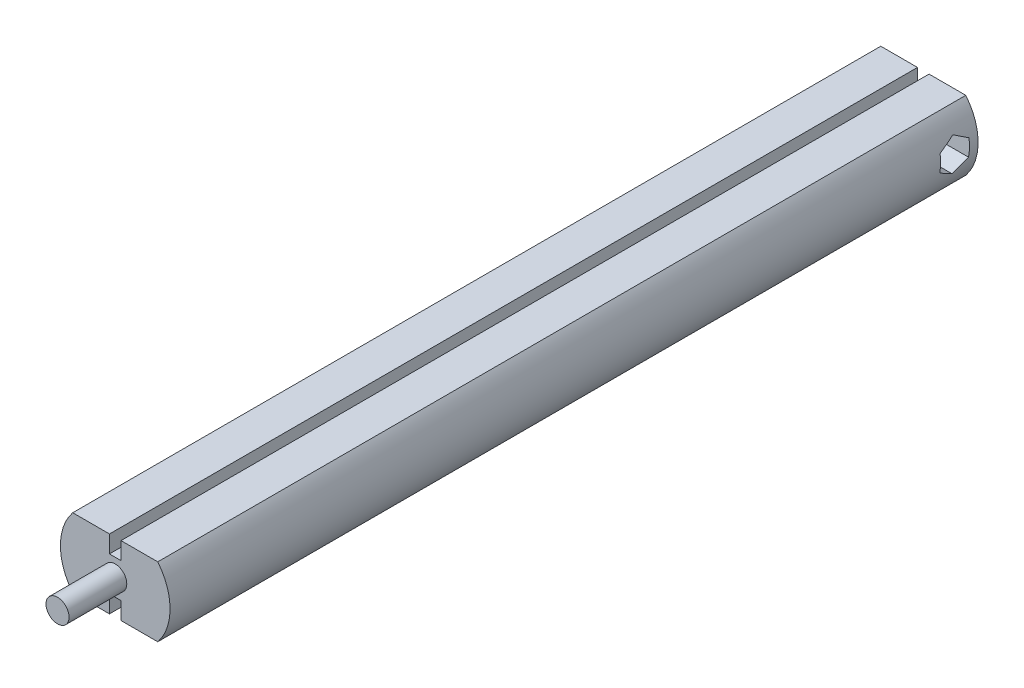
ISO-10303-21;
HEADER;
FILE_DESCRIPTION(('STEP AP214'),'2;1');
FILE_NAME('part.step','',(''),(''),'','','');
FILE_SCHEMA(('AUTOMOTIVE_DESIGN { 1 0 10303 214 1 1 1 1 }'));
ENDSEC;
DATA;
#1=APPLICATION_CONTEXT('core data for automotive mechanical design processes');
#2=APPLICATION_PROTOCOL_DEFINITION('international standard','automotive_design',2000,#1);
#3=PRODUCT_CONTEXT('',#1,'mechanical');
#4=PRODUCT('Part','Part','',(#3));
#5=PRODUCT_RELATED_PRODUCT_CATEGORY('part','',(#4));
#6=PRODUCT_DEFINITION_FORMATION('','',#4);
#7=PRODUCT_DEFINITION_CONTEXT('part definition',#1,'design');
#8=PRODUCT_DEFINITION('design','',#6,#7);
#9=PRODUCT_DEFINITION_SHAPE('','',#8);
#10=(LENGTH_UNIT() NAMED_UNIT(*) SI_UNIT(.MILLI.,.METRE.));
#11=(NAMED_UNIT(*) PLANE_ANGLE_UNIT() SI_UNIT($,.RADIAN.));
#12=(NAMED_UNIT(*) SI_UNIT($,.STERADIAN.) SOLID_ANGLE_UNIT());
#13=UNCERTAINTY_MEASURE_WITH_UNIT(LENGTH_MEASURE(1.E-05),#10,'distance_accuracy_value','');
#14=(GEOMETRIC_REPRESENTATION_CONTEXT(3) GLOBAL_UNCERTAINTY_ASSIGNED_CONTEXT((#13)) GLOBAL_UNIT_ASSIGNED_CONTEXT((#10,
#11,#12)) REPRESENTATION_CONTEXT('',''));
#15=CARTESIAN_POINT('',(0.,0.,0.));
#16=DIRECTION('',(0.,0.,1.));
#17=DIRECTION('',(1.,0.,0.));
#18=AXIS2_PLACEMENT_3D('',#15,#16,#17);
#19=CARTESIAN_POINT('',(0.,0.,70.));
#20=DIRECTION('',(0.,0.,1.));
#21=DIRECTION('',(1.,0.,0.));
#22=AXIS2_PLACEMENT_3D('',#19,#20,#21);
#23=PLANE('',#22);
#24=CARTESIAN_POINT('',(0.,0.,70.));
#25=DIRECTION('',(0.,0.,1.));
#26=DIRECTION('',(1.,0.,0.));
#27=AXIS2_PLACEMENT_3D('',#24,#25,#26);
#28=CIRCLE('',#27,1.);
#29=CARTESIAN_POINT('',(1.,0.,70.));
#30=VERTEX_POINT('',#29);
#31=EDGE_CURVE('E11',#30,#30,#28,.T.);
#32=ORIENTED_EDGE('',*,*,#31,.F.);
#33=EDGE_LOOP('',(#32));
#34=FACE_BOUND('',#33,.T.);
#35=DIRECTION('',(1.,0.,0.));
#36=VECTOR('',#35,1.);
#37=CARTESIAN_POINT('',(-0.499999999999996,-1.5,70.));
#38=LINE('',#37,#36);
#39=CARTESIAN_POINT('',(-0.499999999999996,-1.5,70.));
#40=VERTEX_POINT('',#39);
#41=CARTESIAN_POINT('',(0.500000000000004,-1.5,70.));
#42=VERTEX_POINT('',#41);
#43=EDGE_CURVE('E216',#40,#42,#38,.T.);
#44=ORIENTED_EDGE('',*,*,#43,.T.);
#45=DIRECTION('',(0.,-1.,0.));
#46=VECTOR('',#45,1.);
#47=CARTESIAN_POINT('',(0.500000000000004,-1.5,70.));
#48=LINE('',#47,#46);
#49=CARTESIAN_POINT('',(0.500000000000004,-3.,70.));
#50=VERTEX_POINT('',#49);
#51=EDGE_CURVE('E200',#42,#50,#48,.T.);
#52=ORIENTED_EDGE('',*,*,#51,.T.);
#53=DIRECTION('',(1.,0.,0.));
#54=VECTOR('',#53,1.);
#55=CARTESIAN_POINT('',(3.68272996566406,-3.,70.));
#56=LINE('',#55,#54);
#57=CARTESIAN_POINT('',(3.68272996566406,-3.,70.));
#58=VERTEX_POINT('',#57);
#59=EDGE_CURVE('E274',#50,#58,#56,.T.);
#60=ORIENTED_EDGE('',*,*,#59,.T.);
#61=CARTESIAN_POINT('',(0.,0.,70.));
#62=DIRECTION('',(0.,0.,1.));
#63=DIRECTION('',(1.,0.,0.));
#64=AXIS2_PLACEMENT_3D('',#61,#62,#63);
#65=CIRCLE('',#64,4.75);
#66=CARTESIAN_POINT('',(3.68272996566406,3.,70.));
#67=VERTEX_POINT('',#66);
#68=EDGE_CURVE('E367',#58,#67,#65,.T.);
#69=ORIENTED_EDGE('',*,*,#68,.T.);
#70=DIRECTION('',(-1.,0.,0.));
#71=VECTOR('',#70,1.);
#72=CARTESIAN_POINT('',(3.68272996566406,3.,70.));
#73=LINE('',#72,#71);
#74=CARTESIAN_POINT('',(0.500000000000004,3.,70.));
#75=VERTEX_POINT('',#74);
#76=EDGE_CURVE('E285',#67,#75,#73,.T.);
#77=ORIENTED_EDGE('',*,*,#76,.T.);
#78=DIRECTION('',(0.,1.,0.));
#79=VECTOR('',#78,1.);
#80=CARTESIAN_POINT('',(0.500000000000004,1.5,70.));
#81=LINE('',#80,#79);
#82=CARTESIAN_POINT('',(0.500000000000004,1.5,70.));
#83=VERTEX_POINT('',#82);
#84=EDGE_CURVE('E255',#83,#75,#81,.T.);
#85=ORIENTED_EDGE('',*,*,#84,.F.);
#86=DIRECTION('',(1.,0.,0.));
#87=VECTOR('',#86,1.);
#88=CARTESIAN_POINT('',(-0.499999999999996,1.5,70.));
#89=LINE('',#88,#87);
#90=CARTESIAN_POINT('',(-0.499999999999996,1.5,70.));
#91=VERTEX_POINT('',#90);
#92=EDGE_CURVE('E249',#91,#83,#89,.T.);
#93=ORIENTED_EDGE('',*,*,#92,.F.);
#94=DIRECTION('',(0.,1.,0.));
#95=VECTOR('',#94,1.);
#96=CARTESIAN_POINT('',(-0.499999999999996,1.5,70.));
#97=LINE('',#96,#95);
#98=CARTESIAN_POINT('',(-0.499999999999996,3.,70.));
#99=VERTEX_POINT('',#98);
#100=EDGE_CURVE('E258',#91,#99,#97,.T.);
#101=ORIENTED_EDGE('',*,*,#100,.T.);
#102=CARTESIAN_POINT('',(-3.68272996566406,3.,70.));
#103=VERTEX_POINT('',#102);
#104=EDGE_CURVE('E283',#99,#103,#73,.T.);
#105=ORIENTED_EDGE('',*,*,#104,.T.);
#106=CARTESIAN_POINT('',(-3.68272996566406,-3.,70.));
#107=VERTEX_POINT('',#106);
#108=EDGE_CURVE('E370',#103,#107,#65,.T.);
#109=ORIENTED_EDGE('',*,*,#108,.T.);
#110=CARTESIAN_POINT('',(-0.499999999999996,-3.,70.));
#111=VERTEX_POINT('',#110);
#112=EDGE_CURVE('E289',#107,#111,#56,.T.);
#113=ORIENTED_EDGE('',*,*,#112,.T.);
#114=DIRECTION('',(0.,-1.,0.));
#115=VECTOR('',#114,1.);
#116=CARTESIAN_POINT('',(-0.499999999999996,-1.5,70.));
#117=LINE('',#116,#115);
#118=EDGE_CURVE('E53',#40,#111,#117,.T.);
#119=ORIENTED_EDGE('',*,*,#118,.F.);
#120=EDGE_LOOP('',(#44,#52,#60,#69,#77,#85,#93,#101,#105,#109,#113,#119));
#121=FACE_BOUND('',#120,.T.);
#122=ADVANCED_FACE('F37',(#34,#121),#23,.T.);
#123=CARTESIAN_POINT('',(0.,0.,0.));
#124=DIRECTION('',(0.,0.,1.));
#125=DIRECTION('',(1.,0.,0.));
#126=AXIS2_PLACEMENT_3D('',#123,#124,#125);
#127=PLANE('',#126);
#128=DIRECTION('',(0.,-1.,0.));
#129=VECTOR('',#128,1.);
#130=CARTESIAN_POINT('',(0.500000000000003,-1.5,0.));
#131=LINE('',#130,#129);
#132=CARTESIAN_POINT('',(0.500000000000003,-1.72916164657906,0.));
#133=VERTEX_POINT('',#132);
#134=CARTESIAN_POINT('',(0.500000000000003,-3.,0.));
#135=VERTEX_POINT('',#134);
#136=EDGE_CURVE('E227',#133,#135,#131,.T.);
#137=ORIENTED_EDGE('',*,*,#136,.F.);
#138=CARTESIAN_POINT('',(0.,0.,0.));
#139=DIRECTION('',(0.,0.,-1.));
#140=DIRECTION('',(-1.,0.,0.));
#141=AXIS2_PLACEMENT_3D('',#138,#139,#140);
#142=CIRCLE('',#141,1.8);
#143=CARTESIAN_POINT('',(0.94,-1.53505700219894,0.));
#144=VERTEX_POINT('',#143);
#145=EDGE_CURVE('E355',#144,#133,#142,.T.);
#146=ORIENTED_EDGE('',*,*,#145,.F.);
#147=DIRECTION('',(0.,-1.,0.));
#148=VECTOR('',#147,1.);
#149=CARTESIAN_POINT('',(0.94,1.53505700219894,0.));
#150=LINE('',#149,#148);
#151=CARTESIAN_POINT('',(0.94,1.53505700219894,0.));
#152=VERTEX_POINT('',#151);
#153=EDGE_CURVE('E358',#152,#144,#150,.T.);
#154=ORIENTED_EDGE('',*,*,#153,.F.);
#155=CARTESIAN_POINT('',(0.500000000000003,1.72916164657906,0.));
#156=VERTEX_POINT('',#155);
#157=EDGE_CURVE('E345',#156,#152,#142,.T.);
#158=ORIENTED_EDGE('',*,*,#157,.F.);
#159=DIRECTION('',(0.,1.,0.));
#160=VECTOR('',#159,1.);
#161=CARTESIAN_POINT('',(0.500000000000003,1.5,0.));
#162=LINE('',#161,#160);
#163=CARTESIAN_POINT('',(0.500000000000003,3.,0.));
#164=VERTEX_POINT('',#163);
#165=EDGE_CURVE('E252',#156,#164,#162,.T.);
#166=ORIENTED_EDGE('',*,*,#165,.T.);
#167=DIRECTION('',(-1.,0.,0.));
#168=VECTOR('',#167,1.);
#169=CARTESIAN_POINT('',(3.68272996566406,3.,0.));
#170=LINE('',#169,#168);
#171=CARTESIAN_POINT('',(3.68272996566406,3.,0.));
#172=VERTEX_POINT('',#171);
#173=EDGE_CURVE('E275',#172,#164,#170,.T.);
#174=ORIENTED_EDGE('',*,*,#173,.F.);
#175=CARTESIAN_POINT('',(0.,0.,0.));
#176=DIRECTION('',(0.,0.,1.));
#177=DIRECTION('',(1.,0.,0.));
#178=AXIS2_PLACEMENT_3D('',#175,#176,#177);
#179=CIRCLE('',#178,4.75);
#180=CARTESIAN_POINT('',(3.68272996566406,-3.,0.));
#181=VERTEX_POINT('',#180);
#182=EDGE_CURVE('E364',#181,#172,#179,.T.);
#183=ORIENTED_EDGE('',*,*,#182,.F.);
#184=DIRECTION('',(1.,0.,0.));
#185=VECTOR('',#184,1.);
#186=CARTESIAN_POINT('',(3.68272996566406,-3.,0.));
#187=LINE('',#186,#185);
#188=EDGE_CURVE('E294',#135,#181,#187,.T.);
#189=ORIENTED_EDGE('',*,*,#188,.F.);
#190=EDGE_LOOP('',(#137,#146,#154,#158,#166,#174,#183,#189));
#191=FACE_BOUND('',#190,.T.);
#192=ADVANCED_FACE('F419',(#191),#127,.F.);
#193=DIRECTION('',(0.,-1.,0.));
#194=VECTOR('',#193,1.);
#195=CARTESIAN_POINT('',(-0.499999999999997,-1.5,0.));
#196=LINE('',#195,#194);
#197=CARTESIAN_POINT('',(-0.499999999999997,-1.72916164657906,0.));
#198=VERTEX_POINT('',#197);
#199=CARTESIAN_POINT('',(-0.499999999999997,-3.,0.));
#200=VERTEX_POINT('',#199);
#201=EDGE_CURVE('E230',#198,#200,#196,.T.);
#202=ORIENTED_EDGE('',*,*,#201,.T.);
#203=CARTESIAN_POINT('',(-3.68272996566406,-3.,0.));
#204=VERTEX_POINT('',#203);
#205=EDGE_CURVE('E297',#204,#200,#187,.T.);
#206=ORIENTED_EDGE('',*,*,#205,.F.);
#207=CARTESIAN_POINT('',(-3.68272996566406,3.,0.));
#208=VERTEX_POINT('',#207);
#209=EDGE_CURVE('E371',#208,#204,#179,.T.);
#210=ORIENTED_EDGE('',*,*,#209,.F.);
#211=CARTESIAN_POINT('',(-0.499999999999997,3.,0.));
#212=VERTEX_POINT('',#211);
#213=EDGE_CURVE('E279',#212,#208,#170,.T.);
#214=ORIENTED_EDGE('',*,*,#213,.F.);
#215=DIRECTION('',(0.,1.,0.));
#216=VECTOR('',#215,1.);
#217=CARTESIAN_POINT('',(-0.499999999999997,1.5,0.));
#218=LINE('',#217,#216);
#219=CARTESIAN_POINT('',(-0.499999999999997,1.72916164657906,0.));
#220=VERTEX_POINT('',#219);
#221=EDGE_CURVE('E61',#220,#212,#218,.T.);
#222=ORIENTED_EDGE('',*,*,#221,.F.);
#223=EDGE_CURVE('E359',#198,#220,#142,.T.);
#224=ORIENTED_EDGE('',*,*,#223,.F.);
#225=EDGE_LOOP('',(#202,#206,#210,#214,#222,#224));
#226=FACE_BOUND('',#225,.T.);
#227=ADVANCED_FACE('F390',(#226),#127,.F.);
#228=CARTESIAN_POINT('',(0.,0.,10.));
#229=DIRECTION('',(0.,0.,-1.));
#230=DIRECTION('',(-1.,0.,0.));
#231=AXIS2_PLACEMENT_3D('',#228,#229,#230);
#232=CYLINDRICAL_SURFACE('',#231,1.8);
#233=DIRECTION('',(0.,0.,-1.));
#234=VECTOR('',#233,1.);
#235=CARTESIAN_POINT('',(0.500000000000003,-1.72916164657906,10.));
#236=LINE('',#235,#234);
#237=CARTESIAN_POINT('',(0.500000000000003,-1.72916164657906,10.));
#238=VERTEX_POINT('',#237);
#239=EDGE_CURVE('E240',#238,#133,#236,.T.);
#240=ORIENTED_EDGE('',*,*,#239,.F.);
#241=CARTESIAN_POINT('',(0.,0.,10.));
#242=DIRECTION('',(0.,0.,-1.));
#243=DIRECTION('',(-1.,0.,0.));
#244=AXIS2_PLACEMENT_3D('',#241,#242,#243);
#245=CIRCLE('',#244,1.8);
#246=CARTESIAN_POINT('',(0.94,-1.53505700219894,10.));
#247=VERTEX_POINT('',#246);
#248=EDGE_CURVE('E346',#247,#238,#245,.T.);
#249=ORIENTED_EDGE('',*,*,#248,.F.);
#250=DIRECTION('',(0.,0.,-1.));
#251=VECTOR('',#250,1.);
#252=CARTESIAN_POINT('',(0.94,-1.53505700219894,10.));
#253=LINE('',#252,#251);
#254=EDGE_CURVE('E362',#247,#144,#253,.T.);
#255=ORIENTED_EDGE('',*,*,#254,.T.);
#256=ORIENTED_EDGE('',*,*,#145,.T.);
#257=EDGE_LOOP('',(#240,#249,#255,#256));
#258=FACE_BOUND('',#257,.T.);
#259=ADVANCED_FACE('F415',(#258),#232,.F.);
#260=DIRECTION('',(0.,0.,-1.));
#261=VECTOR('',#260,1.);
#262=CARTESIAN_POINT('',(-0.499999999999997,-1.72916164657906,10.));
#263=LINE('',#262,#261);
#264=CARTESIAN_POINT('',(-0.499999999999997,-1.72916164657906,10.));
#265=VERTEX_POINT('',#264);
#266=EDGE_CURVE('E236',#198,#265,#263,.F.);
#267=ORIENTED_EDGE('',*,*,#266,.F.);
#268=ORIENTED_EDGE('',*,*,#223,.T.);
#269=DIRECTION('',(0.,0.,-1.));
#270=VECTOR('',#269,1.);
#271=CARTESIAN_POINT('',(-0.499999999999997,1.72916164657906,10.));
#272=LINE('',#271,#270);
#273=CARTESIAN_POINT('',(-0.499999999999997,1.72916164657906,10.));
#274=VERTEX_POINT('',#273);
#275=EDGE_CURVE('E266',#220,#274,#272,.F.);
#276=ORIENTED_EDGE('',*,*,#275,.T.);
#277=EDGE_CURVE('E350',#265,#274,#245,.T.);
#278=ORIENTED_EDGE('',*,*,#277,.F.);
#279=EDGE_LOOP('',(#267,#268,#276,#278));
#280=FACE_BOUND('',#279,.T.);
#281=ADVANCED_FACE('F397',(#280),#232,.F.);
#282=CARTESIAN_POINT('',(0.,0.,10.));
#283=DIRECTION('',(0.,0.,-1.));
#284=DIRECTION('',(-1.,0.,0.));
#285=AXIS2_PLACEMENT_3D('',#282,#283,#284);
#286=PLANE('',#285);
#287=ORIENTED_EDGE('',*,*,#248,.T.);
#288=DIRECTION('',(0.,1.,0.));
#289=VECTOR('',#288,1.);
#290=CARTESIAN_POINT('',(0.500000000000003,0.,10.));
#291=LINE('',#290,#289);
#292=CARTESIAN_POINT('',(0.500000000000003,-1.5,10.));
#293=VERTEX_POINT('',#292);
#294=EDGE_CURVE('E238',#238,#293,#291,.T.);
#295=ORIENTED_EDGE('',*,*,#294,.T.);
#296=DIRECTION('',(1.,0.,0.));
#297=VECTOR('',#296,1.);
#298=CARTESIAN_POINT('',(0.,-1.5,10.));
#299=LINE('',#298,#297);
#300=CARTESIAN_POINT('',(-0.499999999999997,-1.5,10.));
#301=VERTEX_POINT('',#300);
#302=EDGE_CURVE('E41',#301,#293,#299,.T.);
#303=ORIENTED_EDGE('',*,*,#302,.F.);
#304=DIRECTION('',(0.,-1.,0.));
#305=VECTOR('',#304,1.);
#306=CARTESIAN_POINT('',(-0.499999999999997,0.,10.));
#307=LINE('',#306,#305);
#308=EDGE_CURVE('E229',#301,#265,#307,.T.);
#309=ORIENTED_EDGE('',*,*,#308,.T.);
#310=ORIENTED_EDGE('',*,*,#277,.T.);
#311=DIRECTION('',(0.,1.,0.));
#312=VECTOR('',#311,1.);
#313=CARTESIAN_POINT('',(-0.499999999999997,0.,10.));
#314=LINE('',#313,#312);
#315=CARTESIAN_POINT('',(-0.499999999999997,1.5,10.));
#316=VERTEX_POINT('',#315);
#317=EDGE_CURVE('E257',#316,#274,#314,.T.);
#318=ORIENTED_EDGE('',*,*,#317,.F.);
#319=DIRECTION('',(-1.,0.,0.));
#320=VECTOR('',#319,1.);
#321=CARTESIAN_POINT('',(0.,1.5,10.));
#322=LINE('',#321,#320);
#323=CARTESIAN_POINT('',(0.500000000000003,1.5,10.));
#324=VERTEX_POINT('',#323);
#325=EDGE_CURVE('E373',#324,#316,#322,.T.);
#326=ORIENTED_EDGE('',*,*,#325,.F.);
#327=DIRECTION('',(0.,-1.,0.));
#328=VECTOR('',#327,1.);
#329=CARTESIAN_POINT('',(0.500000000000003,0.,10.));
#330=LINE('',#329,#328);
#331=CARTESIAN_POINT('',(0.500000000000003,1.72916164657906,10.));
#332=VERTEX_POINT('',#331);
#333=EDGE_CURVE('E269',#332,#324,#330,.T.);
#334=ORIENTED_EDGE('',*,*,#333,.F.);
#335=CARTESIAN_POINT('',(0.94,1.53505700219894,10.));
#336=VERTEX_POINT('',#335);
#337=EDGE_CURVE('E351',#332,#336,#245,.T.);
#338=ORIENTED_EDGE('',*,*,#337,.T.);
#339=DIRECTION('',(0.,-1.,0.));
#340=VECTOR('',#339,1.);
#341=CARTESIAN_POINT('',(0.94,1.53505700219894,10.));
#342=LINE('',#341,#340);
#343=EDGE_CURVE('E349',#336,#247,#342,.T.);
#344=ORIENTED_EDGE('',*,*,#343,.T.);
#345=EDGE_LOOP('',(#287,#295,#303,#309,#310,#318,#326,#334,#338,#344));
#346=FACE_BOUND('',#345,.T.);
#347=ADVANCED_FACE('F403',(#346),#286,.T.);
#348=CARTESIAN_POINT('',(3.68272996566406,-3.,70.001));
#349=DIRECTION('',(0.,1.,0.));
#350=DIRECTION('',(0.,0.,1.));
#351=AXIS2_PLACEMENT_3D('',#348,#349,#350);
#352=PLANE('',#351);
#353=DIRECTION('',(0.,0.,-1.));
#354=VECTOR('',#353,1.);
#355=CARTESIAN_POINT('',(0.500000000000004,-3.,70.));
#356=LINE('',#355,#354);
#357=EDGE_CURVE('E206',#50,#135,#356,.T.);
#358=ORIENTED_EDGE('',*,*,#357,.T.);
#359=ORIENTED_EDGE('',*,*,#188,.T.);
#360=DIRECTION('',(0.,0.,-1.));
#361=VECTOR('',#360,1.);
#362=CARTESIAN_POINT('',(3.68272996566406,-3.,70.001));
#363=LINE('',#362,#361);
#364=EDGE_CURVE('E291',#58,#181,#363,.T.);
#365=ORIENTED_EDGE('',*,*,#364,.F.);
#366=ORIENTED_EDGE('',*,*,#59,.F.);
#367=EDGE_LOOP('',(#358,#359,#365,#366));
#368=FACE_BOUND('',#367,.T.);
#369=ADVANCED_FACE('F424',(#368),#352,.F.);
#370=DIRECTION('',(0.,0.,1.));
#371=VECTOR('',#370,1.);
#372=CARTESIAN_POINT('',(-0.499999999999996,-3.,70.));
#373=LINE('',#372,#371);
#374=EDGE_CURVE('E218',#200,#111,#373,.T.);
#375=ORIENTED_EDGE('',*,*,#374,.T.);
#376=ORIENTED_EDGE('',*,*,#112,.F.);
#377=DIRECTION('',(0.,0.,-1.));
#378=VECTOR('',#377,1.);
#379=CARTESIAN_POINT('',(-3.68272996566406,-3.,70.001));
#380=LINE('',#379,#378);
#381=EDGE_CURVE('E292',#107,#204,#380,.T.);
#382=ORIENTED_EDGE('',*,*,#381,.T.);
#383=ORIENTED_EDGE('',*,*,#205,.T.);
#384=EDGE_LOOP('',(#375,#376,#382,#383));
#385=FACE_BOUND('',#384,.T.);
#386=ADVANCED_FACE('F388',(#385),#352,.F.);
#387=ORIENTED_EDGE('',*,*,#337,.F.);
#388=DIRECTION('',(0.,0.,-1.));
#389=VECTOR('',#388,1.);
#390=CARTESIAN_POINT('',(0.500000000000003,1.72916164657906,10.));
#391=LINE('',#390,#389);
#392=EDGE_CURVE('E271',#332,#156,#391,.T.);
#393=ORIENTED_EDGE('',*,*,#392,.T.);
#394=ORIENTED_EDGE('',*,*,#157,.T.);
#395=DIRECTION('',(0.,0.,-1.));
#396=VECTOR('',#395,1.);
#397=CARTESIAN_POINT('',(0.94,1.53505700219894,10.));
#398=LINE('',#397,#396);
#399=EDGE_CURVE('E354',#336,#152,#398,.T.);
#400=ORIENTED_EDGE('',*,*,#399,.F.);
#401=EDGE_LOOP('',(#387,#393,#394,#400));
#402=FACE_BOUND('',#401,.T.);
#403=ADVANCED_FACE('F406',(#402),#232,.F.);
#404=CARTESIAN_POINT('',(3.68272996566406,3.,70.001));
#405=DIRECTION('',(0.,-1.,0.));
#406=DIRECTION('',(0.,0.,-1.));
#407=AXIS2_PLACEMENT_3D('',#404,#405,#406);
#408=PLANE('',#407);
#409=ORIENTED_EDGE('',*,*,#173,.T.);
#410=DIRECTION('',(0.,0.,-1.));
#411=VECTOR('',#410,1.);
#412=CARTESIAN_POINT('',(0.500000000000004,3.,70.));
#413=LINE('',#412,#411);
#414=EDGE_CURVE('E242',#75,#164,#413,.T.);
#415=ORIENTED_EDGE('',*,*,#414,.F.);
#416=ORIENTED_EDGE('',*,*,#76,.F.);
#417=DIRECTION('',(0.,0.,-1.));
#418=VECTOR('',#417,1.);
#419=CARTESIAN_POINT('',(3.68272996566406,3.,70.001));
#420=LINE('',#419,#418);
#421=EDGE_CURVE('E278',#67,#172,#420,.T.);
#422=ORIENTED_EDGE('',*,*,#421,.T.);
#423=EDGE_LOOP('',(#409,#415,#416,#422));
#424=FACE_BOUND('',#423,.T.);
#425=ADVANCED_FACE('F432',(#424),#408,.F.);
#426=CARTESIAN_POINT('',(0.,0.,70.));
#427=DIRECTION('',(0.,0.,-1.));
#428=DIRECTION('',(-1.,0.,0.));
#429=AXIS2_PLACEMENT_3D('',#426,#427,#428);
#430=CYLINDRICAL_SURFACE('',#429,4.75);
#431=ORIENTED_EDGE('',*,*,#108,.F.);
#432=DIRECTION('',(0.,0.,-1.));
#433=VECTOR('',#432,1.);
#434=CARTESIAN_POINT('',(-3.68272996566406,3.,70.001));
#435=LINE('',#434,#433);
#436=EDGE_CURVE('E280',#103,#208,#435,.T.);
#437=ORIENTED_EDGE('',*,*,#436,.T.);
#438=ORIENTED_EDGE('',*,*,#209,.T.);
#439=ORIENTED_EDGE('',*,*,#381,.F.);
#440=EDGE_LOOP('',(#431,#437,#438,#439));
#441=FACE_BOUND('',#440,.T.);
#442=ADVANCED_FACE('F383',(#441),#430,.T.);
#443=CARTESIAN_POINT('',(0.,0.,-0.392498521632215));
#444=DIRECTION('',(0.,0.852659897031211,-0.522466362548561));
#445=DIRECTION('',(0.,-0.522466362548561,-0.852659897031211));
#446=AXIS2_PLACEMENT_3D('',#443,#444,#445);
#447=ELLIPSE('',#446,9.09149438220246,4.75);
#448=CARTESIAN_POINT('',(4.52554859875823,1.44288249011393,1.96227132316201));
#449=VERTEX_POINT('',#448);
#450=CARTESIAN_POINT('',(4.69979783309166,0.688767252464093,0.731562770466588));
#451=VERTEX_POINT('',#450);
#452=EDGE_CURVE('E332',#449,#451,#447,.T.);
#453=ORIENTED_EDGE('',*,*,#452,.T.);
#454=CARTESIAN_POINT('',(0.,0.,0.749572745126936));
#455=DIRECTION('',(0.,-0.026139194074299,-0.999658312891533));
#456=DIRECTION('',(0.,0.999658312891533,-0.026139194074299));
#457=AXIS2_PLACEMENT_3D('',#454,#455,#456);
#458=ELLIPSE('',#457,4.75162356851765,4.75);
#459=CARTESIAN_POINT('',(4.6897558793976,-0.754115237649842,0.769291447304579));
#460=VERTEX_POINT('',#459);
#461=EDGE_CURVE('E335',#451,#460,#458,.T.);
#462=ORIENTED_EDGE('',*,*,#461,.T.);
#463=CARTESIAN_POINT('',(0.,0.,-0.619490959773303));
#464=DIRECTION('',(0.,-0.87879909110551,-0.477191950342972));
#465=DIRECTION('',(0.,0.477191950342972,-0.87879909110551));
#466=AXIS2_PLACEMENT_3D('',#463,#464,#465);
#467=ELLIPSE('',#466,9.9540656471385,4.75);
#468=CARTESIAN_POINT('',(4.52554859875823,-1.44288249011393,2.03772867683799));
#469=VERTEX_POINT('',#468);
#470=EDGE_CURVE('E337',#460,#469,#467,.T.);
#471=ORIENTED_EDGE('',*,*,#470,.T.);
#472=CARTESIAN_POINT('',(0.,0.,4.39249852163222));
#473=DIRECTION('',(0.,-0.852659897031211,0.522466362548561));
#474=DIRECTION('',(0.,-0.522466362548561,-0.852659897031211));
#475=AXIS2_PLACEMENT_3D('',#472,#473,#474);
#476=ELLIPSE('',#475,9.09149438220246,4.75);
#477=CARTESIAN_POINT('',(4.69979783309166,-0.688767252464093,3.26843722953341));
#478=VERTEX_POINT('',#477);
#479=EDGE_CURVE('E340',#469,#478,#476,.T.);
#480=ORIENTED_EDGE('',*,*,#479,.T.);
#481=CARTESIAN_POINT('',(0.,0.,3.25042725487305));
#482=DIRECTION('',(0.,0.026139194074299,0.999658312891533));
#483=DIRECTION('',(0.,0.999658312891533,-0.026139194074299));
#484=AXIS2_PLACEMENT_3D('',#481,#482,#483);
#485=ELLIPSE('',#484,4.75162356851765,4.75);
#486=CARTESIAN_POINT('',(4.6897558793976,0.754115237649841,3.23070855269542));
#487=VERTEX_POINT('',#486);
#488=EDGE_CURVE('E343',#478,#487,#485,.T.);
#489=ORIENTED_EDGE('',*,*,#488,.T.);
#490=CARTESIAN_POINT('',(0.,0.,4.61949095977329));
#491=DIRECTION('',(0.,0.87879909110551,0.477191950342972));
#492=DIRECTION('',(0.,0.477191950342972,-0.87879909110551));
#493=AXIS2_PLACEMENT_3D('',#490,#491,#492);
#494=ELLIPSE('',#493,9.9540656471385,4.75);
#495=EDGE_CURVE('E319',#487,#449,#494,.T.);
#496=ORIENTED_EDGE('',*,*,#495,.T.);
#497=EDGE_LOOP('',(#453,#462,#471,#480,#489,#496));
#498=FACE_BOUND('',#497,.T.);
#499=ORIENTED_EDGE('',*,*,#182,.T.);
#500=ORIENTED_EDGE('',*,*,#421,.F.);
#501=ORIENTED_EDGE('',*,*,#68,.F.);
#502=ORIENTED_EDGE('',*,*,#364,.T.);
#503=EDGE_LOOP('',(#499,#500,#501,#502));
#504=FACE_BOUND('',#503,.T.);
#505=ADVANCED_FACE('F39',(#498,#504),#430,.T.);
#506=CARTESIAN_POINT('',(0.94,1.53505700219894,10.));
#507=DIRECTION('',(1.,0.,0.));
#508=DIRECTION('',(0.,0.,-1.));
#509=AXIS2_PLACEMENT_3D('',#506,#507,#508);
#510=PLANE('',#509);
#511=DIRECTION('',(0.,0.477191950342972,-0.87879909110551));
#512=VECTOR('',#511,1.);
#513=CARTESIAN_POINT('',(0.94,0.754115237649841,3.23070855269542));
#514=LINE('',#513,#512);
#515=CARTESIAN_POINT('',(0.94,0.754115237649841,3.23070855269542));
#516=VERTEX_POINT('',#515);
#517=CARTESIAN_POINT('',(0.94,1.44288249011393,1.96227132316201));
#518=VERTEX_POINT('',#517);
#519=EDGE_CURVE('E301',#516,#518,#514,.T.);
#520=ORIENTED_EDGE('',*,*,#519,.F.);
#521=DIRECTION('',(0.,0.999658312891533,-0.026139194074299));
#522=VECTOR('',#521,1.);
#523=CARTESIAN_POINT('',(0.94,-0.688767252464093,3.26843722953341));
#524=LINE('',#523,#522);
#525=CARTESIAN_POINT('',(0.94,-0.688767252464093,3.26843722953341));
#526=VERTEX_POINT('',#525);
#527=EDGE_CURVE('E288',#526,#516,#524,.T.);
#528=ORIENTED_EDGE('',*,*,#527,.F.);
#529=DIRECTION('',(0.,0.522466362548561,0.852659897031211));
#530=VECTOR('',#529,1.);
#531=CARTESIAN_POINT('',(0.94,-1.44288249011393,2.03772867683799));
#532=LINE('',#531,#530);
#533=CARTESIAN_POINT('',(0.94,-1.44288249011393,2.03772867683799));
#534=VERTEX_POINT('',#533);
#535=EDGE_CURVE('E313',#534,#526,#532,.T.);
#536=ORIENTED_EDGE('',*,*,#535,.F.);
#537=DIRECTION('',(0.,-0.477191950342972,0.87879909110551));
#538=VECTOR('',#537,1.);
#539=CARTESIAN_POINT('',(0.94,-0.754115237649842,0.769291447304579));
#540=LINE('',#539,#538);
#541=CARTESIAN_POINT('',(0.94,-0.754115237649842,0.769291447304579));
#542=VERTEX_POINT('',#541);
#543=EDGE_CURVE('E310',#542,#534,#540,.T.);
#544=ORIENTED_EDGE('',*,*,#543,.F.);
#545=DIRECTION('',(0.,-0.999658312891533,0.026139194074299));
#546=VECTOR('',#545,1.);
#547=CARTESIAN_POINT('',(0.94,0.688767252464093,0.731562770466588));
#548=LINE('',#547,#546);
#549=CARTESIAN_POINT('',(0.94,0.688767252464093,0.731562770466588));
#550=VERTEX_POINT('',#549);
#551=EDGE_CURVE('E307',#550,#542,#548,.T.);
#552=ORIENTED_EDGE('',*,*,#551,.F.);
#553=DIRECTION('',(0.,-0.522466362548561,-0.852659897031211));
#554=VECTOR('',#553,1.);
#555=CARTESIAN_POINT('',(0.94,1.44288249011393,1.96227132316201));
#556=LINE('',#555,#554);
#557=EDGE_CURVE('E304',#518,#550,#556,.T.);
#558=ORIENTED_EDGE('',*,*,#557,.F.);
#559=EDGE_LOOP('',(#520,#528,#536,#544,#552,#558));
#560=FACE_BOUND('',#559,.T.);
#561=ORIENTED_EDGE('',*,*,#153,.T.);
#562=ORIENTED_EDGE('',*,*,#254,.F.);
#563=ORIENTED_EDGE('',*,*,#343,.F.);
#564=ORIENTED_EDGE('',*,*,#399,.T.);
#565=EDGE_LOOP('',(#561,#562,#563,#564));
#566=FACE_BOUND('',#565,.T.);
#567=ADVANCED_FACE('F410',(#560,#566),#510,.F.);
#568=CARTESIAN_POINT('',(4.75,-0.688767252464093,3.26843722953341));
#569=DIRECTION('',(0.,0.026139194074299,0.999658312891533));
#570=DIRECTION('',(0.,-0.999658312891533,0.026139194074299));
#571=AXIS2_PLACEMENT_3D('',#568,#569,#570);
#572=PLANE('',#571);
#573=DIRECTION('',(-1.,0.,0.));
#574=VECTOR('',#573,1.);
#575=CARTESIAN_POINT('',(4.75,-0.688767252464093,3.26843722953341));
#576=LINE('',#575,#574);
#577=EDGE_CURVE('E317',#478,#526,#576,.T.);
#578=ORIENTED_EDGE('',*,*,#577,.T.);
#579=ORIENTED_EDGE('',*,*,#527,.T.);
#580=DIRECTION('',(-1.,0.,0.));
#581=VECTOR('',#580,1.);
#582=CARTESIAN_POINT('',(4.75,0.754115237649841,3.23070855269542));
#583=LINE('',#582,#581);
#584=EDGE_CURVE('E316',#487,#516,#583,.T.);
#585=ORIENTED_EDGE('',*,*,#584,.F.);
#586=ORIENTED_EDGE('',*,*,#488,.F.);
#587=EDGE_LOOP('',(#578,#579,#585,#586));
#588=FACE_BOUND('',#587,.T.);
#589=ADVANCED_FACE('F460',(#588),#572,.F.);
#590=CARTESIAN_POINT('',(4.75,-1.44288249011393,2.03772867683799));
#591=DIRECTION('',(0.,-0.852659897031211,0.522466362548561));
#592=DIRECTION('',(0.,-0.522466362548561,-0.852659897031211));
#593=AXIS2_PLACEMENT_3D('',#590,#591,#592);
#594=PLANE('',#593);
#595=DIRECTION('',(-1.,0.,0.));
#596=VECTOR('',#595,1.);
#597=CARTESIAN_POINT('',(4.75,-1.44288249011393,2.03772867683799));
#598=LINE('',#597,#596);
#599=EDGE_CURVE('E320',#469,#534,#598,.T.);
#600=ORIENTED_EDGE('',*,*,#599,.T.);
#601=ORIENTED_EDGE('',*,*,#535,.T.);
#602=ORIENTED_EDGE('',*,*,#577,.F.);
#603=ORIENTED_EDGE('',*,*,#479,.F.);
#604=EDGE_LOOP('',(#600,#601,#602,#603));
#605=FACE_BOUND('',#604,.T.);
#606=ADVANCED_FACE('F466',(#605),#594,.F.);
#607=CARTESIAN_POINT('',(4.75,-0.754115237649842,0.769291447304579));
#608=DIRECTION('',(0.,-0.87879909110551,-0.477191950342972));
#609=DIRECTION('',(0.,0.477191950342972,-0.87879909110551));
#610=AXIS2_PLACEMENT_3D('',#607,#608,#609);
#611=PLANE('',#610);
#612=DIRECTION('',(-1.,0.,0.));
#613=VECTOR('',#612,1.);
#614=CARTESIAN_POINT('',(4.75,-0.754115237649842,0.769291447304579));
#615=LINE('',#614,#613);
#616=EDGE_CURVE('E322',#460,#542,#615,.T.);
#617=ORIENTED_EDGE('',*,*,#616,.T.);
#618=ORIENTED_EDGE('',*,*,#543,.T.);
#619=ORIENTED_EDGE('',*,*,#599,.F.);
#620=ORIENTED_EDGE('',*,*,#470,.F.);
#621=EDGE_LOOP('',(#617,#618,#619,#620));
#622=FACE_BOUND('',#621,.T.);
#623=ADVANCED_FACE('F479',(#622),#611,.F.);
#624=CARTESIAN_POINT('',(4.75,0.688767252464093,0.731562770466588));
#625=DIRECTION('',(0.,-0.026139194074299,-0.999658312891533));
#626=DIRECTION('',(0.,0.999658312891533,-0.026139194074299));
#627=AXIS2_PLACEMENT_3D('',#624,#625,#626);
#628=PLANE('',#627);
#629=DIRECTION('',(-1.,0.,0.));
#630=VECTOR('',#629,1.);
#631=CARTESIAN_POINT('',(4.75,0.688767252464093,0.731562770466588));
#632=LINE('',#631,#630);
#633=EDGE_CURVE('E324',#451,#550,#632,.T.);
#634=ORIENTED_EDGE('',*,*,#633,.T.);
#635=ORIENTED_EDGE('',*,*,#551,.T.);
#636=ORIENTED_EDGE('',*,*,#616,.F.);
#637=ORIENTED_EDGE('',*,*,#461,.F.);
#638=EDGE_LOOP('',(#634,#635,#636,#637));
#639=FACE_BOUND('',#638,.T.);
#640=ADVANCED_FACE('F475',(#639),#628,.F.);
#641=CARTESIAN_POINT('',(4.75,1.44288249011393,1.96227132316201));
#642=DIRECTION('',(0.,0.852659897031211,-0.522466362548561));
#643=DIRECTION('',(0.,0.522466362548561,0.852659897031211));
#644=AXIS2_PLACEMENT_3D('',#641,#642,#643);
#645=PLANE('',#644);
#646=DIRECTION('',(-1.,0.,0.));
#647=VECTOR('',#646,1.);
#648=CARTESIAN_POINT('',(4.75,1.44288249011393,1.96227132316201));
#649=LINE('',#648,#647);
#650=EDGE_CURVE('E326',#449,#518,#649,.T.);
#651=ORIENTED_EDGE('',*,*,#650,.T.);
#652=ORIENTED_EDGE('',*,*,#557,.T.);
#653=ORIENTED_EDGE('',*,*,#633,.F.);
#654=ORIENTED_EDGE('',*,*,#452,.F.);
#655=EDGE_LOOP('',(#651,#652,#653,#654));
#656=FACE_BOUND('',#655,.T.);
#657=ADVANCED_FACE('F471',(#656),#645,.F.);
#658=CARTESIAN_POINT('',(4.75,0.754115237649841,3.23070855269542));
#659=DIRECTION('',(0.,0.87879909110551,0.477191950342972));
#660=DIRECTION('',(0.,-0.477191950342972,0.87879909110551));
#661=AXIS2_PLACEMENT_3D('',#658,#659,#660);
#662=PLANE('',#661);
#663=ORIENTED_EDGE('',*,*,#584,.T.);
#664=ORIENTED_EDGE('',*,*,#519,.T.);
#665=ORIENTED_EDGE('',*,*,#650,.F.);
#666=ORIENTED_EDGE('',*,*,#495,.F.);
#667=EDGE_LOOP('',(#663,#664,#665,#666));
#668=FACE_BOUND('',#667,.T.);
#669=ADVANCED_FACE('F468',(#668),#662,.F.);
#670=ORIENTED_EDGE('',*,*,#104,.F.);
#671=DIRECTION('',(0.,0.,1.));
#672=VECTOR('',#671,1.);
#673=CARTESIAN_POINT('',(-0.499999999999996,3.,70.));
#674=LINE('',#673,#672);
#675=EDGE_CURVE('E247',#212,#99,#674,.T.);
#676=ORIENTED_EDGE('',*,*,#675,.F.);
#677=ORIENTED_EDGE('',*,*,#213,.T.);
#678=ORIENTED_EDGE('',*,*,#436,.F.);
#679=EDGE_LOOP('',(#670,#676,#677,#678));
#680=FACE_BOUND('',#679,.T.);
#681=ADVANCED_FACE('F438',(#680),#408,.F.);
#682=CARTESIAN_POINT('',(0.500000000000004,1.5,70.));
#683=DIRECTION('',(1.,0.,0.));
#684=DIRECTION('',(0.,0.,-1.));
#685=AXIS2_PLACEMENT_3D('',#682,#683,#684);
#686=PLANE('',#685);
#687=ORIENTED_EDGE('',*,*,#333,.T.);
#688=DIRECTION('',(0.,0.,-1.));
#689=VECTOR('',#688,1.);
#690=CARTESIAN_POINT('',(0.500000000000004,1.5,70.));
#691=LINE('',#690,#689);
#692=EDGE_CURVE('E243',#83,#324,#691,.T.);
#693=ORIENTED_EDGE('',*,*,#692,.F.);
#694=ORIENTED_EDGE('',*,*,#84,.T.);
#695=ORIENTED_EDGE('',*,*,#414,.T.);
#696=ORIENTED_EDGE('',*,*,#165,.F.);
#697=ORIENTED_EDGE('',*,*,#392,.F.);
#698=EDGE_LOOP('',(#687,#693,#694,#695,#696,#697));
#699=FACE_BOUND('',#698,.T.);
#700=ADVANCED_FACE('F434',(#699),#686,.F.);
#701=CARTESIAN_POINT('',(-0.499999999999996,1.5,70.));
#702=DIRECTION('',(-1.,0.,0.));
#703=DIRECTION('',(0.,0.,1.));
#704=AXIS2_PLACEMENT_3D('',#701,#702,#703);
#705=PLANE('',#704);
#706=ORIENTED_EDGE('',*,*,#221,.T.);
#707=ORIENTED_EDGE('',*,*,#675,.T.);
#708=ORIENTED_EDGE('',*,*,#100,.F.);
#709=DIRECTION('',(0.,0.,1.));
#710=VECTOR('',#709,1.);
#711=CARTESIAN_POINT('',(-0.499999999999996,1.5,70.));
#712=LINE('',#711,#710);
#713=EDGE_CURVE('E246',#316,#91,#712,.T.);
#714=ORIENTED_EDGE('',*,*,#713,.F.);
#715=ORIENTED_EDGE('',*,*,#317,.T.);
#716=ORIENTED_EDGE('',*,*,#275,.F.);
#717=EDGE_LOOP('',(#706,#707,#708,#714,#715,#716));
#718=FACE_BOUND('',#717,.T.);
#719=ADVANCED_FACE('F439',(#718),#705,.F.);
#720=CARTESIAN_POINT('',(0.,1.5,0.));
#721=DIRECTION('',(0.,-1.,0.));
#722=DIRECTION('',(0.,0.,-1.));
#723=AXIS2_PLACEMENT_3D('',#720,#721,#722);
#724=PLANE('',#723);
#725=ORIENTED_EDGE('',*,*,#325,.T.);
#726=ORIENTED_EDGE('',*,*,#713,.T.);
#727=ORIENTED_EDGE('',*,*,#92,.T.);
#728=ORIENTED_EDGE('',*,*,#692,.T.);
#729=EDGE_LOOP('',(#725,#726,#727,#728));
#730=FACE_BOUND('',#729,.T.);
#731=ADVANCED_FACE('F435',(#730),#724,.F.);
#732=CARTESIAN_POINT('',(0.500000000000004,-1.5,70.));
#733=DIRECTION('',(-1.,0.,0.));
#734=DIRECTION('',(0.,0.,1.));
#735=AXIS2_PLACEMENT_3D('',#732,#733,#734);
#736=PLANE('',#735);
#737=ORIENTED_EDGE('',*,*,#239,.T.);
#738=ORIENTED_EDGE('',*,*,#136,.T.);
#739=ORIENTED_EDGE('',*,*,#357,.F.);
#740=ORIENTED_EDGE('',*,*,#51,.F.);
#741=DIRECTION('',(0.,0.,-1.));
#742=VECTOR('',#741,1.);
#743=CARTESIAN_POINT('',(0.500000000000004,-1.5,70.));
#744=LINE('',#743,#742);
#745=EDGE_CURVE('E203',#42,#293,#744,.T.);
#746=ORIENTED_EDGE('',*,*,#745,.T.);
#747=ORIENTED_EDGE('',*,*,#294,.F.);
#748=EDGE_LOOP('',(#737,#738,#739,#740,#746,#747));
#749=FACE_BOUND('',#748,.T.);
#750=ADVANCED_FACE('F202',(#749),#736,.T.);
#751=CARTESIAN_POINT('',(-0.499999999999996,-1.5,70.));
#752=DIRECTION('',(1.,0.,0.));
#753=DIRECTION('',(0.,0.,-1.));
#754=AXIS2_PLACEMENT_3D('',#751,#752,#753);
#755=PLANE('',#754);
#756=ORIENTED_EDGE('',*,*,#266,.T.);
#757=ORIENTED_EDGE('',*,*,#308,.F.);
#758=DIRECTION('',(0.,0.,1.));
#759=VECTOR('',#758,1.);
#760=CARTESIAN_POINT('',(-0.499999999999996,-1.5,70.));
#761=LINE('',#760,#759);
#762=EDGE_CURVE('E210',#301,#40,#761,.T.);
#763=ORIENTED_EDGE('',*,*,#762,.T.);
#764=ORIENTED_EDGE('',*,*,#118,.T.);
#765=ORIENTED_EDGE('',*,*,#374,.F.);
#766=ORIENTED_EDGE('',*,*,#201,.F.);
#767=EDGE_LOOP('',(#756,#757,#763,#764,#765,#766));
#768=FACE_BOUND('',#767,.T.);
#769=ADVANCED_FACE('F394',(#768),#755,.T.);
#770=CARTESIAN_POINT('',(0.,-1.5,0.));
#771=DIRECTION('',(0.,1.,0.));
#772=DIRECTION('',(0.,0.,-1.));
#773=AXIS2_PLACEMENT_3D('',#770,#771,#772);
#774=PLANE('',#773);
#775=ORIENTED_EDGE('',*,*,#302,.T.);
#776=ORIENTED_EDGE('',*,*,#745,.F.);
#777=ORIENTED_EDGE('',*,*,#43,.F.);
#778=ORIENTED_EDGE('',*,*,#762,.F.);
#779=EDGE_LOOP('',(#775,#776,#777,#778));
#780=FACE_BOUND('',#779,.T.);
#781=ADVANCED_FACE('F214',(#780),#774,.F.);
#782=CARTESIAN_POINT('',(0.,0.,75.));
#783=DIRECTION('',(0.,0.,-1.));
#784=DIRECTION('',(-1.,0.,0.));
#785=AXIS2_PLACEMENT_3D('',#782,#783,#784);
#786=CYLINDRICAL_SURFACE('',#785,1.);
#787=CARTESIAN_POINT('',(0.,0.,75.));
#788=DIRECTION('',(0.,0.,1.));
#789=DIRECTION('',(1.,0.,0.));
#790=AXIS2_PLACEMENT_3D('',#787,#788,#789);
#791=CIRCLE('',#790,1.);
#792=CARTESIAN_POINT('',(1.,0.,75.));
#793=VERTEX_POINT('',#792);
#794=EDGE_CURVE('E225',#793,#793,#791,.T.);
#795=ORIENTED_EDGE('',*,*,#794,.F.);
#796=EDGE_LOOP('',(#795));
#797=FACE_BOUND('',#796,.T.);
#798=ORIENTED_EDGE('',*,*,#31,.T.);
#799=EDGE_LOOP('',(#798));
#800=FACE_BOUND('',#799,.T.);
#801=ADVANCED_FACE('F546',(#797,#800),#786,.T.);
#802=CARTESIAN_POINT('',(0.,0.,75.));
#803=DIRECTION('',(0.,0.,1.));
#804=DIRECTION('',(1.,0.,0.));
#805=AXIS2_PLACEMENT_3D('',#802,#803,#804);
#806=PLANE('',#805);
#807=ORIENTED_EDGE('',*,*,#794,.T.);
#808=EDGE_LOOP('',(#807));
#809=FACE_BOUND('',#808,.T.);
#810=ADVANCED_FACE('F561',(#809),#806,.T.);
#811=CLOSED_SHELL('',(#122,#192,#227,#259,#281,#347,#369,#386,#403,#425,#442,#505,#567,#589,
#606,#623,#640,#657,#669,#681,#700,#719,#731,#750,#769,#781,#801,#810));
#812=MANIFOLD_SOLID_BREP('B2',#811);
#813=ADVANCED_BREP_SHAPE_REPRESENTATION('',(#18,#812),#14);
#814=SHAPE_DEFINITION_REPRESENTATION(#9,#813);
ENDSEC;
END-ISO-10303-21;
